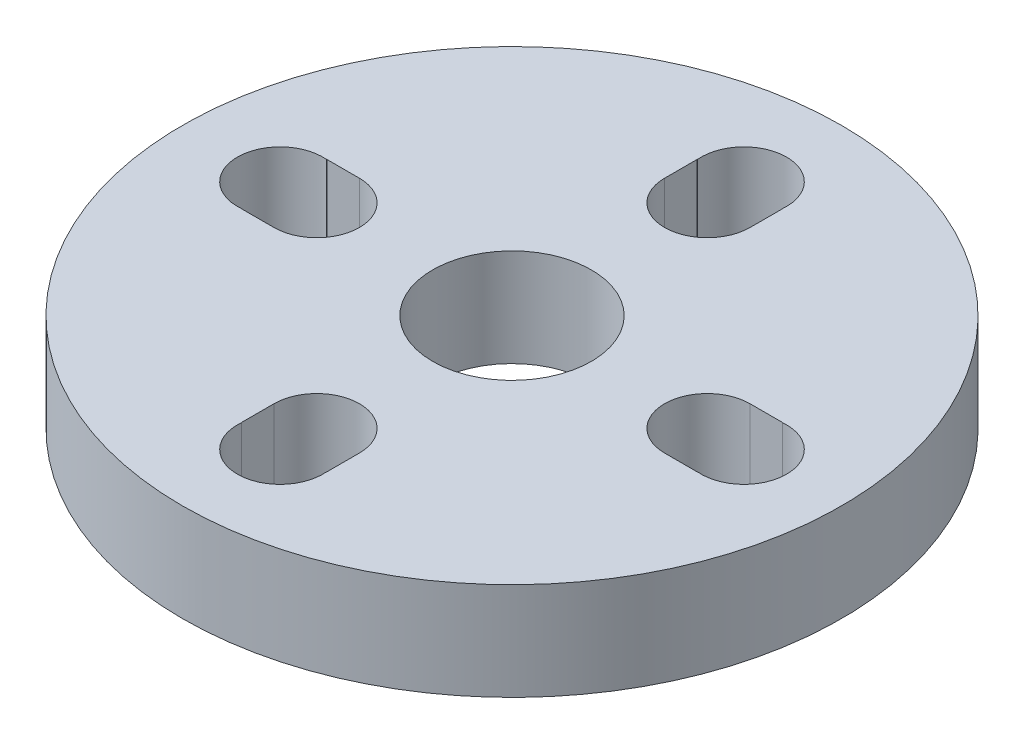
ISO-10303-21;
HEADER;
FILE_DESCRIPTION(('STEP AP214'),'2;1');
FILE_NAME('part.step','',(''),(''),'','','');
FILE_SCHEMA(('AUTOMOTIVE_DESIGN { 1 0 10303 214 1 1 1 1 }'));
ENDSEC;
DATA;
#1=APPLICATION_CONTEXT('core data for automotive mechanical design processes');
#2=APPLICATION_PROTOCOL_DEFINITION('international standard','automotive_design',2000,#1);
#3=PRODUCT_CONTEXT('',#1,'mechanical');
#4=PRODUCT('Part','Part','',(#3));
#5=PRODUCT_RELATED_PRODUCT_CATEGORY('part','',(#4));
#6=PRODUCT_DEFINITION_FORMATION('','',#4);
#7=PRODUCT_DEFINITION_CONTEXT('part definition',#1,'design');
#8=PRODUCT_DEFINITION('design','',#6,#7);
#9=PRODUCT_DEFINITION_SHAPE('','',#8);
#10=(LENGTH_UNIT() NAMED_UNIT(*) SI_UNIT(.MILLI.,.METRE.));
#11=(NAMED_UNIT(*) PLANE_ANGLE_UNIT() SI_UNIT($,.RADIAN.));
#12=(NAMED_UNIT(*) SI_UNIT($,.STERADIAN.) SOLID_ANGLE_UNIT());
#13=UNCERTAINTY_MEASURE_WITH_UNIT(LENGTH_MEASURE(1.E-05),#10,'distance_accuracy_value','');
#14=(GEOMETRIC_REPRESENTATION_CONTEXT(3) GLOBAL_UNCERTAINTY_ASSIGNED_CONTEXT((#13)) GLOBAL_UNIT_ASSIGNED_CONTEXT((#10,
#11,#12)) REPRESENTATION_CONTEXT('',''));
#15=CARTESIAN_POINT('',(0.,0.,0.));
#16=DIRECTION('',(0.,0.,1.));
#17=DIRECTION('',(1.,0.,0.));
#18=AXIS2_PLACEMENT_3D('',#15,#16,#17);
#19=CARTESIAN_POINT('',(0.,4.,0.));
#20=DIRECTION('',(0.,1.,0.));
#21=DIRECTION('',(0.,0.,1.));
#22=AXIS2_PLACEMENT_3D('',#19,#20,#21);
#23=PLANE('',#22);
#24=DIRECTION('',(0.,0.,-1.));
#25=VECTOR('',#24,1.);
#26=CARTESIAN_POINT('',(1.75000000000001,4.,0.));
#27=LINE('',#26,#25);
#28=CARTESIAN_POINT('',(1.75000000000004,4.,9.33742469849154));
#29=VERTEX_POINT('',#28);
#30=CARTESIAN_POINT('',(1.75000000000003,4.,7.99999999999999));
#31=VERTEX_POINT('',#30);
#32=EDGE_CURVE('E492',#29,#31,#27,.T.);
#33=ORIENTED_EDGE('',*,*,#32,.F.);
#34=CARTESIAN_POINT('',(0.,4.,0.));
#35=DIRECTION('',(0.,1.,0.));
#36=DIRECTION('',(0.,0.,1.));
#37=AXIS2_PLACEMENT_3D('',#34,#35,#36);
#38=CIRCLE('',#37,9.5);
#39=CARTESIAN_POINT('',(1.74256123286303,4.,9.33881578947368));
#40=VERTEX_POINT('',#39);
#41=EDGE_CURVE('E500',#40,#29,#38,.T.);
#42=ORIENTED_EDGE('',*,*,#41,.F.);
#43=CARTESIAN_POINT('',(0.,4.,9.5));
#44=DIRECTION('',(0.,-1.,0.));
#45=DIRECTION('',(0.,0.,-1.));
#46=AXIS2_PLACEMENT_3D('',#43,#44,#45);
#47=CIRCLE('',#46,1.75);
#48=CARTESIAN_POINT('',(-1.74256123286296,4.,9.33881578947369));
#49=VERTEX_POINT('',#48);
#50=EDGE_CURVE('E483',#40,#49,#47,.T.);
#51=ORIENTED_EDGE('',*,*,#50,.T.);
#52=CARTESIAN_POINT('',(0.,4.,0.));
#53=DIRECTION('',(0.,1.,0.));
#54=DIRECTION('',(0.,0.,1.));
#55=AXIS2_PLACEMENT_3D('',#52,#53,#54);
#56=CIRCLE('',#55,9.5);
#57=CARTESIAN_POINT('',(-1.74999999999996,4.,9.33742469849156));
#58=VERTEX_POINT('',#57);
#59=EDGE_CURVE('E320',#58,#49,#56,.T.);
#60=ORIENTED_EDGE('',*,*,#59,.F.);
#61=DIRECTION('',(0.,0.,-1.));
#62=VECTOR('',#61,1.);
#63=CARTESIAN_POINT('',(-1.75,4.,0.));
#64=LINE('',#63,#62);
#65=CARTESIAN_POINT('',(-1.74999999999997,4.,8.00000000000001));
#66=VERTEX_POINT('',#65);
#67=EDGE_CURVE('E465',#58,#66,#64,.T.);
#68=ORIENTED_EDGE('',*,*,#67,.T.);
#69=CARTESIAN_POINT('',(0.,4.,8.));
#70=DIRECTION('',(0.,-1.,0.));
#71=DIRECTION('',(0.,0.,-1.));
#72=AXIS2_PLACEMENT_3D('',#69,#70,#71);
#73=CIRCLE('',#72,1.75);
#74=EDGE_CURVE('E797',#66,#31,#73,.T.);
#75=ORIENTED_EDGE('',*,*,#74,.T.);
#76=EDGE_LOOP('',(#33,#42,#51,#60,#68,#75));
#77=FACE_BOUND('',#76,.T.);
#78=CARTESIAN_POINT('',(0.,4.,0.));
#79=DIRECTION('',(0.,1.,0.));
#80=DIRECTION('',(0.,0.,1.));
#81=AXIS2_PLACEMENT_3D('',#78,#79,#80);
#82=CIRCLE('',#81,3.25);
#83=CARTESIAN_POINT('',(0.,4.,3.25));
#84=VERTEX_POINT('',#83);
#85=EDGE_CURVE('E590',#84,#84,#82,.T.);
#86=ORIENTED_EDGE('',*,*,#85,.F.);
#87=EDGE_LOOP('',(#86));
#88=FACE_BOUND('',#87,.T.);
#89=CARTESIAN_POINT('',(0.,4.,0.));
#90=DIRECTION('',(0.,1.,0.));
#91=DIRECTION('',(0.,0.,1.));
#92=AXIS2_PLACEMENT_3D('',#89,#90,#91);
#93=CIRCLE('',#92,9.5);
#94=CARTESIAN_POINT('',(1.75000000000004,4.,-9.33742469849154));
#95=VERTEX_POINT('',#94);
#96=CARTESIAN_POINT('',(1.74256123286303,4.,-9.33881578947368));
#97=VERTEX_POINT('',#96);
#98=EDGE_CURVE('E585',#95,#97,#93,.T.);
#99=ORIENTED_EDGE('',*,*,#98,.F.);
#100=DIRECTION('',(0.,0.,1.));
#101=VECTOR('',#100,1.);
#102=CARTESIAN_POINT('',(1.75000000000001,4.,0.));
#103=LINE('',#102,#101);
#104=CARTESIAN_POINT('',(1.75000000000003,4.,-7.99999999999999));
#105=VERTEX_POINT('',#104);
#106=EDGE_CURVE('E593',#95,#105,#103,.T.);
#107=ORIENTED_EDGE('',*,*,#106,.T.);
#108=CARTESIAN_POINT('',(0.,4.,-8.));
#109=DIRECTION('',(0.,1.,0.));
#110=DIRECTION('',(0.,0.,1.));
#111=AXIS2_PLACEMENT_3D('',#108,#109,#110);
#112=CIRCLE('',#111,1.75);
#113=CARTESIAN_POINT('',(-1.74999999999996,4.,-8.00000000000001));
#114=VERTEX_POINT('',#113);
#115=EDGE_CURVE('E556',#114,#105,#112,.T.);
#116=ORIENTED_EDGE('',*,*,#115,.F.);
#117=DIRECTION('',(0.,0.,1.));
#118=VECTOR('',#117,1.);
#119=CARTESIAN_POINT('',(-1.75,4.,0.));
#120=LINE('',#119,#118);
#121=CARTESIAN_POINT('',(-1.74999999999996,4.,-9.33742469849156));
#122=VERTEX_POINT('',#121);
#123=EDGE_CURVE('E572',#122,#114,#120,.T.);
#124=ORIENTED_EDGE('',*,*,#123,.F.);
#125=CARTESIAN_POINT('',(0.,4.,0.));
#126=DIRECTION('',(0.,1.,0.));
#127=DIRECTION('',(0.,0.,1.));
#128=AXIS2_PLACEMENT_3D('',#125,#126,#127);
#129=CIRCLE('',#128,9.5);
#130=CARTESIAN_POINT('',(-1.74256123286295,4.,-9.33881578947369));
#131=VERTEX_POINT('',#130);
#132=EDGE_CURVE('E578',#131,#122,#129,.T.);
#133=ORIENTED_EDGE('',*,*,#132,.F.);
#134=CARTESIAN_POINT('',(0.,4.,-9.5));
#135=DIRECTION('',(0.,1.,0.));
#136=DIRECTION('',(0.,0.,1.));
#137=AXIS2_PLACEMENT_3D('',#134,#135,#136);
#138=CIRCLE('',#137,1.75);
#139=EDGE_CURVE('E555',#97,#131,#138,.T.);
#140=ORIENTED_EDGE('',*,*,#139,.F.);
#141=EDGE_LOOP('',(#99,#107,#116,#124,#133,#140));
#142=FACE_BOUND('',#141,.T.);
#143=DIRECTION('',(1.,0.,0.));
#144=VECTOR('',#143,1.);
#145=CARTESIAN_POINT('',(0.,4.,1.75));
#146=LINE('',#145,#144);
#147=CARTESIAN_POINT('',(-9.33742469849155,4.,1.75));
#148=VERTEX_POINT('',#147);
#149=CARTESIAN_POINT('',(-8.,4.,1.75));
#150=VERTEX_POINT('',#149);
#151=EDGE_CURVE('E613',#148,#150,#146,.T.);
#152=ORIENTED_EDGE('',*,*,#151,.F.);
#153=CARTESIAN_POINT('',(0.,4.,0.));
#154=DIRECTION('',(0.,1.,0.));
#155=DIRECTION('',(0.,0.,1.));
#156=AXIS2_PLACEMENT_3D('',#153,#154,#155);
#157=CIRCLE('',#156,9.5);
#158=CARTESIAN_POINT('',(-9.33881578947368,4.,1.74256123286299));
#159=VERTEX_POINT('',#158);
#160=EDGE_CURVE('E610',#159,#148,#157,.T.);
#161=ORIENTED_EDGE('',*,*,#160,.F.);
#162=CARTESIAN_POINT('',(-9.5,4.,0.));
#163=DIRECTION('',(0.,1.,0.));
#164=DIRECTION('',(0.,0.,1.));
#165=AXIS2_PLACEMENT_3D('',#162,#163,#164);
#166=CIRCLE('',#165,1.75);
#167=CARTESIAN_POINT('',(-9.33881578947368,4.,-1.742561232863));
#168=VERTEX_POINT('',#167);
#169=EDGE_CURVE('E640',#168,#159,#166,.T.);
#170=ORIENTED_EDGE('',*,*,#169,.F.);
#171=CARTESIAN_POINT('',(0.,4.,0.));
#172=DIRECTION('',(0.,1.,0.));
#173=DIRECTION('',(0.,0.,1.));
#174=AXIS2_PLACEMENT_3D('',#171,#172,#173);
#175=CIRCLE('',#174,9.5);
#176=CARTESIAN_POINT('',(-9.33742469849155,4.,-1.75));
#177=VERTEX_POINT('',#176);
#178=EDGE_CURVE('E628',#177,#168,#175,.T.);
#179=ORIENTED_EDGE('',*,*,#178,.F.);
#180=DIRECTION('',(1.,0.,0.));
#181=VECTOR('',#180,1.);
#182=CARTESIAN_POINT('',(0.,4.,-1.75));
#183=LINE('',#182,#181);
#184=CARTESIAN_POINT('',(-8.,4.,-1.75));
#185=VERTEX_POINT('',#184);
#186=EDGE_CURVE('E624',#177,#185,#183,.T.);
#187=ORIENTED_EDGE('',*,*,#186,.T.);
#188=CARTESIAN_POINT('',(-8.,4.,0.));
#189=DIRECTION('',(0.,1.,0.));
#190=DIRECTION('',(0.,0.,1.));
#191=AXIS2_PLACEMENT_3D('',#188,#189,#190);
#192=CIRCLE('',#191,1.75);
#193=EDGE_CURVE('E558',#150,#185,#192,.T.);
#194=ORIENTED_EDGE('',*,*,#193,.F.);
#195=EDGE_LOOP('',(#152,#161,#170,#179,#187,#194));
#196=FACE_BOUND('',#195,.T.);
#197=CARTESIAN_POINT('',(0.,4.,0.));
#198=DIRECTION('',(0.,1.,0.));
#199=DIRECTION('',(0.,0.,1.));
#200=AXIS2_PLACEMENT_3D('',#197,#198,#199);
#201=CIRCLE('',#200,13.5);
#202=CARTESIAN_POINT('',(0.,4.,13.5));
#203=VERTEX_POINT('',#202);
#204=EDGE_CURVE('E12',#203,#203,#201,.T.);
#205=ORIENTED_EDGE('',*,*,#204,.T.);
#206=EDGE_LOOP('',(#205));
#207=FACE_BOUND('',#206,.T.);
#208=CARTESIAN_POINT('',(0.,4.,0.));
#209=DIRECTION('',(0.,1.,0.));
#210=DIRECTION('',(0.,0.,1.));
#211=AXIS2_PLACEMENT_3D('',#208,#209,#210);
#212=CIRCLE('',#211,9.5);
#213=CARTESIAN_POINT('',(9.33881578947368,4.,-1.74256123286299));
#214=VERTEX_POINT('',#213);
#215=CARTESIAN_POINT('',(9.33742469849155,4.,-1.75));
#216=VERTEX_POINT('',#215);
#217=EDGE_CURVE('E527',#214,#216,#212,.T.);
#218=ORIENTED_EDGE('',*,*,#217,.F.);
#219=CARTESIAN_POINT('',(9.5,4.,0.));
#220=DIRECTION('',(0.,-1.,0.));
#221=DIRECTION('',(0.,0.,-1.));
#222=AXIS2_PLACEMENT_3D('',#219,#220,#221);
#223=CIRCLE('',#222,1.75);
#224=CARTESIAN_POINT('',(9.33881578947368,4.,1.74256123286299));
#225=VERTEX_POINT('',#224);
#226=EDGE_CURVE('E509',#214,#225,#223,.T.);
#227=ORIENTED_EDGE('',*,*,#226,.T.);
#228=CARTESIAN_POINT('',(0.,4.,0.));
#229=DIRECTION('',(0.,1.,0.));
#230=DIRECTION('',(0.,0.,1.));
#231=AXIS2_PLACEMENT_3D('',#228,#229,#230);
#232=CIRCLE('',#231,9.5);
#233=CARTESIAN_POINT('',(9.33742469849155,4.,1.75));
#234=VERTEX_POINT('',#233);
#235=EDGE_CURVE('E544',#234,#225,#232,.T.);
#236=ORIENTED_EDGE('',*,*,#235,.F.);
#237=DIRECTION('',(-1.,0.,0.));
#238=VECTOR('',#237,1.);
#239=CARTESIAN_POINT('',(0.,4.,1.75));
#240=LINE('',#239,#238);
#241=CARTESIAN_POINT('',(8.,4.,1.75));
#242=VERTEX_POINT('',#241);
#243=EDGE_CURVE('E537',#234,#242,#240,.T.);
#244=ORIENTED_EDGE('',*,*,#243,.T.);
#245=CARTESIAN_POINT('',(8.,4.,0.));
#246=DIRECTION('',(0.,-1.,0.));
#247=DIRECTION('',(0.,0.,-1.));
#248=AXIS2_PLACEMENT_3D('',#245,#246,#247);
#249=CIRCLE('',#248,1.75);
#250=CARTESIAN_POINT('',(8.,4.,-1.75));
#251=VERTEX_POINT('',#250);
#252=EDGE_CURVE('E515',#242,#251,#249,.T.);
#253=ORIENTED_EDGE('',*,*,#252,.T.);
#254=DIRECTION('',(-1.,0.,0.));
#255=VECTOR('',#254,1.);
#256=CARTESIAN_POINT('',(0.,4.,-1.75));
#257=LINE('',#256,#255);
#258=EDGE_CURVE('E312',#216,#251,#257,.T.);
#259=ORIENTED_EDGE('',*,*,#258,.F.);
#260=EDGE_LOOP('',(#218,#227,#236,#244,#253,#259));
#261=FACE_BOUND('',#260,.T.);
#262=ADVANCED_FACE('F297',(#77,#88,#142,#196,#207,#261),#23,.T.);
#263=CARTESIAN_POINT('',(0.,0.,0.));
#264=DIRECTION('',(0.,1.,0.));
#265=DIRECTION('',(0.,0.,1.));
#266=AXIS2_PLACEMENT_3D('',#263,#264,#265);
#267=PLANE('',#266);
#268=CARTESIAN_POINT('',(0.,0.,0.));
#269=DIRECTION('',(0.,1.,0.));
#270=DIRECTION('',(0.,0.,1.));
#271=AXIS2_PLACEMENT_3D('',#268,#269,#270);
#272=CIRCLE('',#271,13.5);
#273=CARTESIAN_POINT('',(0.,0.,13.5));
#274=VERTEX_POINT('',#273);
#275=EDGE_CURVE('E301',#274,#274,#272,.T.);
#276=ORIENTED_EDGE('',*,*,#275,.F.);
#277=EDGE_LOOP('',(#276));
#278=FACE_BOUND('',#277,.T.);
#279=CARTESIAN_POINT('',(0.,0.,0.));
#280=DIRECTION('',(0.,1.,0.));
#281=DIRECTION('',(0.,0.,1.));
#282=AXIS2_PLACEMENT_3D('',#279,#280,#281);
#283=CIRCLE('',#282,9.5);
#284=CARTESIAN_POINT('',(-9.33742469849155,0.,1.75));
#285=VERTEX_POINT('',#284);
#286=CARTESIAN_POINT('',(-9.33881578947368,0.,1.742561232863));
#287=VERTEX_POINT('',#286);
#288=EDGE_CURVE('E605',#285,#287,#283,.F.);
#289=ORIENTED_EDGE('',*,*,#288,.F.);
#290=DIRECTION('',(-1.,0.,0.));
#291=VECTOR('',#290,1.);
#292=CARTESIAN_POINT('',(0.,0.,1.75));
#293=LINE('',#292,#291);
#294=CARTESIAN_POINT('',(-8.,0.,1.75));
#295=VERTEX_POINT('',#294);
#296=EDGE_CURVE('E607',#295,#285,#293,.T.);
#297=ORIENTED_EDGE('',*,*,#296,.F.);
#298=CARTESIAN_POINT('',(-8.,0.,0.));
#299=DIRECTION('',(0.,1.,0.));
#300=DIRECTION('',(0.,0.,1.));
#301=AXIS2_PLACEMENT_3D('',#298,#299,#300);
#302=CIRCLE('',#301,1.75);
#303=CARTESIAN_POINT('',(-8.,0.,-1.75));
#304=VERTEX_POINT('',#303);
#305=EDGE_CURVE('E643',#304,#295,#302,.F.);
#306=ORIENTED_EDGE('',*,*,#305,.F.);
#307=DIRECTION('',(-1.,0.,0.));
#308=VECTOR('',#307,1.);
#309=CARTESIAN_POINT('',(0.,0.,-1.75));
#310=LINE('',#309,#308);
#311=CARTESIAN_POINT('',(-9.33742469849155,0.,-1.75));
#312=VERTEX_POINT('',#311);
#313=EDGE_CURVE('E608',#304,#312,#310,.T.);
#314=ORIENTED_EDGE('',*,*,#313,.T.);
#315=CARTESIAN_POINT('',(0.,0.,0.));
#316=DIRECTION('',(0.,1.,0.));
#317=DIRECTION('',(0.,0.,1.));
#318=AXIS2_PLACEMENT_3D('',#315,#316,#317);
#319=CIRCLE('',#318,9.5);
#320=CARTESIAN_POINT('',(-9.33881578947368,0.,-1.74256123286299));
#321=VERTEX_POINT('',#320);
#322=EDGE_CURVE('E622',#321,#312,#319,.F.);
#323=ORIENTED_EDGE('',*,*,#322,.F.);
#324=CARTESIAN_POINT('',(-9.5,0.,0.));
#325=DIRECTION('',(0.,1.,0.));
#326=DIRECTION('',(0.,0.,1.));
#327=AXIS2_PLACEMENT_3D('',#324,#325,#326);
#328=CIRCLE('',#327,1.75);
#329=EDGE_CURVE('E625',#287,#321,#328,.F.);
#330=ORIENTED_EDGE('',*,*,#329,.F.);
#331=EDGE_LOOP('',(#289,#297,#306,#314,#323,#330));
#332=FACE_BOUND('',#331,.T.);
#333=DIRECTION('',(0.,0.,-1.));
#334=VECTOR('',#333,1.);
#335=CARTESIAN_POINT('',(1.75000000000001,0.,0.));
#336=LINE('',#335,#334);
#337=CARTESIAN_POINT('',(1.75000000000003,0.,-7.99999999999999));
#338=VERTEX_POINT('',#337);
#339=CARTESIAN_POINT('',(1.75000000000004,0.,-9.33742469849154));
#340=VERTEX_POINT('',#339);
#341=EDGE_CURVE('E568',#338,#340,#336,.T.);
#342=ORIENTED_EDGE('',*,*,#341,.T.);
#343=CARTESIAN_POINT('',(0.,0.,0.));
#344=DIRECTION('',(0.,1.,0.));
#345=DIRECTION('',(0.,0.,1.));
#346=AXIS2_PLACEMENT_3D('',#343,#344,#345);
#347=CIRCLE('',#346,9.5);
#348=CARTESIAN_POINT('',(1.74256123286303,0.,-9.33881578947368));
#349=VERTEX_POINT('',#348);
#350=EDGE_CURVE('E596',#349,#340,#347,.F.);
#351=ORIENTED_EDGE('',*,*,#350,.F.);
#352=CARTESIAN_POINT('',(0.,0.,-9.5));
#353=DIRECTION('',(0.,1.,0.));
#354=DIRECTION('',(0.,0.,1.));
#355=AXIS2_PLACEMENT_3D('',#352,#353,#354);
#356=CIRCLE('',#355,1.75);
#357=CARTESIAN_POINT('',(-1.74256123286295,0.,-9.33881578947369));
#358=VERTEX_POINT('',#357);
#359=EDGE_CURVE('E552',#358,#349,#356,.F.);
#360=ORIENTED_EDGE('',*,*,#359,.F.);
#361=CARTESIAN_POINT('',(0.,0.,0.));
#362=DIRECTION('',(0.,1.,0.));
#363=DIRECTION('',(0.,0.,1.));
#364=AXIS2_PLACEMENT_3D('',#361,#362,#363);
#365=CIRCLE('',#364,9.5);
#366=CARTESIAN_POINT('',(-1.74999999999996,0.,-9.33742469849156));
#367=VERTEX_POINT('',#366);
#368=EDGE_CURVE('E564',#367,#358,#365,.F.);
#369=ORIENTED_EDGE('',*,*,#368,.F.);
#370=DIRECTION('',(0.,0.,-1.));
#371=VECTOR('',#370,1.);
#372=CARTESIAN_POINT('',(-1.75,0.,0.));
#373=LINE('',#372,#371);
#374=CARTESIAN_POINT('',(-1.74999999999997,0.,-8.00000000000001));
#375=VERTEX_POINT('',#374);
#376=EDGE_CURVE('E561',#375,#367,#373,.T.);
#377=ORIENTED_EDGE('',*,*,#376,.F.);
#378=CARTESIAN_POINT('',(0.,0.,-8.));
#379=DIRECTION('',(0.,1.,0.));
#380=DIRECTION('',(0.,0.,1.));
#381=AXIS2_PLACEMENT_3D('',#378,#379,#380);
#382=CIRCLE('',#381,1.75);
#383=EDGE_CURVE('E559',#338,#375,#382,.F.);
#384=ORIENTED_EDGE('',*,*,#383,.F.);
#385=EDGE_LOOP('',(#342,#351,#360,#369,#377,#384));
#386=FACE_BOUND('',#385,.T.);
#387=CARTESIAN_POINT('',(0.,0.,0.));
#388=DIRECTION('',(0.,1.,0.));
#389=DIRECTION('',(0.,0.,1.));
#390=AXIS2_PLACEMENT_3D('',#387,#388,#389);
#391=CIRCLE('',#390,3.25);
#392=CARTESIAN_POINT('',(0.,0.,3.25));
#393=VERTEX_POINT('',#392);
#394=EDGE_CURVE('E600',#393,#393,#391,.F.);
#395=ORIENTED_EDGE('',*,*,#394,.F.);
#396=EDGE_LOOP('',(#395));
#397=FACE_BOUND('',#396,.T.);
#398=CARTESIAN_POINT('',(0.,0.,0.));
#399=DIRECTION('',(0.,1.,0.));
#400=DIRECTION('',(0.,0.,1.));
#401=AXIS2_PLACEMENT_3D('',#398,#399,#400);
#402=CIRCLE('',#401,9.5);
#403=CARTESIAN_POINT('',(1.75000000000004,0.,9.33742469849154));
#404=VERTEX_POINT('',#403);
#405=CARTESIAN_POINT('',(1.74256123286304,0.,9.33881578947368));
#406=VERTEX_POINT('',#405);
#407=EDGE_CURVE('E467',#404,#406,#402,.F.);
#408=ORIENTED_EDGE('',*,*,#407,.F.);
#409=DIRECTION('',(0.,0.,1.));
#410=VECTOR('',#409,1.);
#411=CARTESIAN_POINT('',(1.75000000000001,0.,0.));
#412=LINE('',#411,#410);
#413=CARTESIAN_POINT('',(1.75000000000003,0.,7.99999999999999));
#414=VERTEX_POINT('',#413);
#415=EDGE_CURVE('E503',#414,#404,#412,.T.);
#416=ORIENTED_EDGE('',*,*,#415,.F.);
#417=CARTESIAN_POINT('',(0.,0.,8.));
#418=DIRECTION('',(0.,1.,0.));
#419=DIRECTION('',(0.,0.,1.));
#420=AXIS2_PLACEMENT_3D('',#417,#418,#419);
#421=CIRCLE('',#420,1.75);
#422=CARTESIAN_POINT('',(-1.74999999999997,0.,8.00000000000001));
#423=VERTEX_POINT('',#422);
#424=EDGE_CURVE('E482',#414,#423,#421,.T.);
#425=ORIENTED_EDGE('',*,*,#424,.T.);
#426=DIRECTION('',(0.,0.,1.));
#427=VECTOR('',#426,1.);
#428=CARTESIAN_POINT('',(-1.75,0.,0.));
#429=LINE('',#428,#427);
#430=CARTESIAN_POINT('',(-1.74999999999996,0.,9.33742469849156));
#431=VERTEX_POINT('',#430);
#432=EDGE_CURVE('E462',#423,#431,#429,.T.);
#433=ORIENTED_EDGE('',*,*,#432,.T.);
#434=CARTESIAN_POINT('',(0.,0.,0.));
#435=DIRECTION('',(0.,1.,0.));
#436=DIRECTION('',(0.,0.,1.));
#437=AXIS2_PLACEMENT_3D('',#434,#435,#436);
#438=CIRCLE('',#437,9.5);
#439=CARTESIAN_POINT('',(-1.74256123286296,0.,9.33881578947369));
#440=VERTEX_POINT('',#439);
#441=EDGE_CURVE('E470',#440,#431,#438,.F.);
#442=ORIENTED_EDGE('',*,*,#441,.F.);
#443=CARTESIAN_POINT('',(0.,0.,9.5));
#444=DIRECTION('',(0.,1.,0.));
#445=DIRECTION('',(0.,0.,1.));
#446=AXIS2_PLACEMENT_3D('',#443,#444,#445);
#447=CIRCLE('',#446,1.75);
#448=EDGE_CURVE('E486',#440,#406,#447,.T.);
#449=ORIENTED_EDGE('',*,*,#448,.T.);
#450=EDGE_LOOP('',(#408,#416,#425,#433,#442,#449));
#451=FACE_BOUND('',#450,.T.);
#452=CARTESIAN_POINT('',(9.5,0.,0.));
#453=DIRECTION('',(0.,1.,0.));
#454=DIRECTION('',(0.,0.,1.));
#455=AXIS2_PLACEMENT_3D('',#452,#453,#454);
#456=CIRCLE('',#455,1.75);
#457=CARTESIAN_POINT('',(9.33881578947368,0.,1.742561232863));
#458=VERTEX_POINT('',#457);
#459=CARTESIAN_POINT('',(9.33881578947368,0.,-1.74256123286299));
#460=VERTEX_POINT('',#459);
#461=EDGE_CURVE('E497',#458,#460,#456,.T.);
#462=ORIENTED_EDGE('',*,*,#461,.T.);
#463=CARTESIAN_POINT('',(0.,0.,0.));
#464=DIRECTION('',(0.,1.,0.));
#465=DIRECTION('',(0.,0.,1.));
#466=AXIS2_PLACEMENT_3D('',#463,#464,#465);
#467=CIRCLE('',#466,9.5);
#468=CARTESIAN_POINT('',(9.33742469849155,0.,-1.75));
#469=VERTEX_POINT('',#468);
#470=EDGE_CURVE('E518',#469,#460,#467,.F.);
#471=ORIENTED_EDGE('',*,*,#470,.F.);
#472=DIRECTION('',(1.,0.,0.));
#473=VECTOR('',#472,1.);
#474=CARTESIAN_POINT('',(0.,0.,-1.75));
#475=LINE('',#474,#473);
#476=CARTESIAN_POINT('',(8.,0.,-1.75));
#477=VERTEX_POINT('',#476);
#478=EDGE_CURVE('E530',#477,#469,#475,.T.);
#479=ORIENTED_EDGE('',*,*,#478,.F.);
#480=CARTESIAN_POINT('',(8.,0.,0.));
#481=DIRECTION('',(0.,1.,0.));
#482=DIRECTION('',(0.,0.,1.));
#483=AXIS2_PLACEMENT_3D('',#480,#481,#482);
#484=CIRCLE('',#483,1.75);
#485=CARTESIAN_POINT('',(8.,0.,1.75));
#486=VERTEX_POINT('',#485);
#487=EDGE_CURVE('E512',#477,#486,#484,.T.);
#488=ORIENTED_EDGE('',*,*,#487,.T.);
#489=DIRECTION('',(1.,0.,0.));
#490=VECTOR('',#489,1.);
#491=CARTESIAN_POINT('',(0.,0.,1.75));
#492=LINE('',#491,#490);
#493=CARTESIAN_POINT('',(9.33742469849155,0.,1.75));
#494=VERTEX_POINT('',#493);
#495=EDGE_CURVE('E525',#486,#494,#492,.T.);
#496=ORIENTED_EDGE('',*,*,#495,.T.);
#497=CARTESIAN_POINT('',(0.,0.,0.));
#498=DIRECTION('',(0.,1.,0.));
#499=DIRECTION('',(0.,0.,1.));
#500=AXIS2_PLACEMENT_3D('',#497,#498,#499);
#501=CIRCLE('',#500,9.5);
#502=EDGE_CURVE('E547',#458,#494,#501,.F.);
#503=ORIENTED_EDGE('',*,*,#502,.F.);
#504=EDGE_LOOP('',(#462,#471,#479,#488,#496,#503));
#505=FACE_BOUND('',#504,.T.);
#506=ADVANCED_FACE('F478',(#278,#332,#386,#397,#451,#505),#267,.F.);
#507=CARTESIAN_POINT('',(0.,4.,0.));
#508=DIRECTION('',(0.,-1.,0.));
#509=DIRECTION('',(0.,0.,-1.));
#510=AXIS2_PLACEMENT_3D('',#507,#508,#509);
#511=CYLINDRICAL_SURFACE('',#510,13.5);
#512=ORIENTED_EDGE('',*,*,#204,.F.);
#513=EDGE_LOOP('',(#512));
#514=FACE_BOUND('',#513,.T.);
#515=ORIENTED_EDGE('',*,*,#275,.T.);
#516=EDGE_LOOP('',(#515));
#517=FACE_BOUND('',#516,.T.);
#518=ADVANCED_FACE('F299',(#514,#517),#511,.T.);
#519=CARTESIAN_POINT('',(0.,-0.00100000000000013,0.));
#520=DIRECTION('',(0.,1.,0.));
#521=DIRECTION('',(0.,0.,1.));
#522=AXIS2_PLACEMENT_3D('',#519,#520,#521);
#523=CYLINDRICAL_SURFACE('',#522,9.5);
#524=ORIENTED_EDGE('',*,*,#288,.T.);
#525=DIRECTION('',(0.,1.,0.));
#526=VECTOR('',#525,1.);
#527=CARTESIAN_POINT('',(-9.33881578947368,-0.00100000000000013,1.74256123286299));
#528=LINE('',#527,#526);
#529=EDGE_CURVE('E616',#287,#159,#528,.T.);
#530=ORIENTED_EDGE('',*,*,#529,.T.);
#531=ORIENTED_EDGE('',*,*,#160,.T.);
#532=DIRECTION('',(0.,1.,0.));
#533=VECTOR('',#532,1.);
#534=CARTESIAN_POINT('',(-9.33742469849155,-0.00100000000000013,1.75));
#535=LINE('',#534,#533);
#536=EDGE_CURVE('E619',#285,#148,#535,.T.);
#537=ORIENTED_EDGE('',*,*,#536,.F.);
#538=EDGE_LOOP('',(#524,#530,#531,#537));
#539=FACE_BOUND('',#538,.T.);
#540=ADVANCED_FACE('F660',(#539),#523,.F.);
#541=CARTESIAN_POINT('',(0.,-0.00100000000000013,1.75));
#542=DIRECTION('',(0.,0.,1.));
#543=DIRECTION('',(1.,0.,0.));
#544=AXIS2_PLACEMENT_3D('',#541,#542,#543);
#545=PLANE('',#544);
#546=ORIENTED_EDGE('',*,*,#296,.T.);
#547=ORIENTED_EDGE('',*,*,#536,.T.);
#548=ORIENTED_EDGE('',*,*,#151,.T.);
#549=DIRECTION('',(0.,1.,0.));
#550=VECTOR('',#549,1.);
#551=CARTESIAN_POINT('',(-8.,-0.00100000000000013,1.75));
#552=LINE('',#551,#550);
#553=EDGE_CURVE('E617',#295,#150,#552,.T.);
#554=ORIENTED_EDGE('',*,*,#553,.F.);
#555=EDGE_LOOP('',(#546,#547,#548,#554));
#556=FACE_BOUND('',#555,.T.);
#557=ADVANCED_FACE('F658',(#556),#545,.F.);
#558=CARTESIAN_POINT('',(0.,-0.00100000000000013,-1.75));
#559=DIRECTION('',(0.,0.,1.));
#560=DIRECTION('',(1.,0.,0.));
#561=AXIS2_PLACEMENT_3D('',#558,#559,#560);
#562=PLANE('',#561);
#563=DIRECTION('',(0.,1.,0.));
#564=VECTOR('',#563,1.);
#565=CARTESIAN_POINT('',(-8.,-0.00100000000000013,-1.75));
#566=LINE('',#565,#564);
#567=EDGE_CURVE('E630',#304,#185,#566,.T.);
#568=ORIENTED_EDGE('',*,*,#567,.T.);
#569=ORIENTED_EDGE('',*,*,#186,.F.);
#570=DIRECTION('',(0.,1.,0.));
#571=VECTOR('',#570,1.);
#572=CARTESIAN_POINT('',(-9.33742469849155,-0.00100000000000013,-1.75));
#573=LINE('',#572,#571);
#574=EDGE_CURVE('E634',#312,#177,#573,.T.);
#575=ORIENTED_EDGE('',*,*,#574,.F.);
#576=ORIENTED_EDGE('',*,*,#313,.F.);
#577=EDGE_LOOP('',(#568,#569,#575,#576));
#578=FACE_BOUND('',#577,.T.);
#579=ADVANCED_FACE('F671',(#578),#562,.T.);
#580=CARTESIAN_POINT('',(0.,-0.00100000000000013,0.));
#581=DIRECTION('',(0.,1.,0.));
#582=DIRECTION('',(0.,0.,1.));
#583=AXIS2_PLACEMENT_3D('',#580,#581,#582);
#584=CYLINDRICAL_SURFACE('',#583,9.5);
#585=ORIENTED_EDGE('',*,*,#322,.T.);
#586=ORIENTED_EDGE('',*,*,#574,.T.);
#587=ORIENTED_EDGE('',*,*,#178,.T.);
#588=DIRECTION('',(0.,1.,0.));
#589=VECTOR('',#588,1.);
#590=CARTESIAN_POINT('',(-9.33881578947368,-0.00100000000000013,-1.74256123286299));
#591=LINE('',#590,#589);
#592=EDGE_CURVE('E631',#321,#168,#591,.T.);
#593=ORIENTED_EDGE('',*,*,#592,.F.);
#594=EDGE_LOOP('',(#585,#586,#587,#593));
#595=FACE_BOUND('',#594,.T.);
#596=ADVANCED_FACE('F676',(#595),#584,.F.);
#597=CARTESIAN_POINT('',(-8.,-0.00100000000000013,0.));
#598=DIRECTION('',(0.,1.,0.));
#599=DIRECTION('',(0.,0.,1.));
#600=AXIS2_PLACEMENT_3D('',#597,#598,#599);
#601=CYLINDRICAL_SURFACE('',#600,1.75);
#602=ORIENTED_EDGE('',*,*,#553,.T.);
#603=ORIENTED_EDGE('',*,*,#193,.T.);
#604=ORIENTED_EDGE('',*,*,#567,.F.);
#605=ORIENTED_EDGE('',*,*,#305,.T.);
#606=EDGE_LOOP('',(#602,#603,#604,#605));
#607=FACE_BOUND('',#606,.T.);
#608=ADVANCED_FACE('F650',(#607),#601,.F.);
#609=CARTESIAN_POINT('',(-9.5,-0.00100000000000013,0.));
#610=DIRECTION('',(0.,1.,0.));
#611=DIRECTION('',(0.,0.,1.));
#612=AXIS2_PLACEMENT_3D('',#609,#610,#611);
#613=CYLINDRICAL_SURFACE('',#612,1.75);
#614=ORIENTED_EDGE('',*,*,#329,.T.);
#615=ORIENTED_EDGE('',*,*,#592,.T.);
#616=ORIENTED_EDGE('',*,*,#169,.T.);
#617=ORIENTED_EDGE('',*,*,#529,.F.);
#618=EDGE_LOOP('',(#614,#615,#616,#617));
#619=FACE_BOUND('',#618,.T.);
#620=ADVANCED_FACE('F678',(#619),#613,.F.);
#621=CARTESIAN_POINT('',(1.75000000000001,-0.00100000000000013,0.));
#622=DIRECTION('',(-1.,0.,0.));
#623=DIRECTION('',(0.,0.,1.));
#624=AXIS2_PLACEMENT_3D('',#621,#622,#623);
#625=PLANE('',#624);
#626=DIRECTION('',(0.,1.,0.));
#627=VECTOR('',#626,1.);
#628=CARTESIAN_POINT('',(1.75000000000003,-0.00100000000000013,-7.99999999999999));
#629=LINE('',#628,#627);
#630=EDGE_CURVE('E583',#338,#105,#629,.T.);
#631=ORIENTED_EDGE('',*,*,#630,.T.);
#632=ORIENTED_EDGE('',*,*,#106,.F.);
#633=DIRECTION('',(0.,1.,0.));
#634=VECTOR('',#633,1.);
#635=CARTESIAN_POINT('',(1.75000000000004,-0.00100000000000013,-9.33742469849154));
#636=LINE('',#635,#634);
#637=EDGE_CURVE('E586',#340,#95,#636,.T.);
#638=ORIENTED_EDGE('',*,*,#637,.F.);
#639=ORIENTED_EDGE('',*,*,#341,.F.);
#640=EDGE_LOOP('',(#631,#632,#638,#639));
#641=FACE_BOUND('',#640,.T.);
#642=ADVANCED_FACE('F680',(#641),#625,.T.);
#643=CARTESIAN_POINT('',(0.,-0.00100000000000013,0.));
#644=DIRECTION('',(0.,1.,0.));
#645=DIRECTION('',(0.,0.,1.));
#646=AXIS2_PLACEMENT_3D('',#643,#644,#645);
#647=CYLINDRICAL_SURFACE('',#646,9.5);
#648=ORIENTED_EDGE('',*,*,#350,.T.);
#649=ORIENTED_EDGE('',*,*,#637,.T.);
#650=ORIENTED_EDGE('',*,*,#98,.T.);
#651=DIRECTION('',(0.,1.,0.));
#652=VECTOR('',#651,1.);
#653=CARTESIAN_POINT('',(1.74256123286303,-0.00100000000000013,-9.33881578947368));
#654=LINE('',#653,#652);
#655=EDGE_CURVE('E588',#349,#97,#654,.T.);
#656=ORIENTED_EDGE('',*,*,#655,.F.);
#657=EDGE_LOOP('',(#648,#649,#650,#656));
#658=FACE_BOUND('',#657,.T.);
#659=ADVANCED_FACE('F686',(#658),#647,.F.);
#660=CARTESIAN_POINT('',(0.,-0.00100000000000013,0.));
#661=DIRECTION('',(0.,1.,0.));
#662=DIRECTION('',(0.,0.,1.));
#663=AXIS2_PLACEMENT_3D('',#660,#661,#662);
#664=CYLINDRICAL_SURFACE('',#663,9.5);
#665=ORIENTED_EDGE('',*,*,#368,.T.);
#666=DIRECTION('',(0.,1.,0.));
#667=VECTOR('',#666,1.);
#668=CARTESIAN_POINT('',(-1.74256123286295,-0.00100000000000013,-9.33881578947369));
#669=LINE('',#668,#667);
#670=EDGE_CURVE('E569',#358,#131,#669,.T.);
#671=ORIENTED_EDGE('',*,*,#670,.T.);
#672=ORIENTED_EDGE('',*,*,#132,.T.);
#673=DIRECTION('',(0.,1.,0.));
#674=VECTOR('',#673,1.);
#675=CARTESIAN_POINT('',(-1.74999999999996,-0.00100000000000013,-9.33742469849156));
#676=LINE('',#675,#674);
#677=EDGE_CURVE('E573',#367,#122,#676,.T.);
#678=ORIENTED_EDGE('',*,*,#677,.F.);
#679=EDGE_LOOP('',(#665,#671,#672,#678));
#680=FACE_BOUND('',#679,.T.);
#681=ADVANCED_FACE('F725',(#680),#664,.F.);
#682=CARTESIAN_POINT('',(-1.75,-0.00100000000000013,0.));
#683=DIRECTION('',(-1.,0.,0.));
#684=DIRECTION('',(0.,0.,1.));
#685=AXIS2_PLACEMENT_3D('',#682,#683,#684);
#686=PLANE('',#685);
#687=ORIENTED_EDGE('',*,*,#376,.T.);
#688=ORIENTED_EDGE('',*,*,#677,.T.);
#689=ORIENTED_EDGE('',*,*,#123,.T.);
#690=DIRECTION('',(0.,1.,0.));
#691=VECTOR('',#690,1.);
#692=CARTESIAN_POINT('',(-1.74999999999997,-0.00100000000000013,-8.00000000000001));
#693=LINE('',#692,#691);
#694=EDGE_CURVE('E567',#375,#114,#693,.T.);
#695=ORIENTED_EDGE('',*,*,#694,.F.);
#696=EDGE_LOOP('',(#687,#688,#689,#695));
#697=FACE_BOUND('',#696,.T.);
#698=ADVANCED_FACE('F721',(#697),#686,.F.);
#699=CARTESIAN_POINT('',(0.,-0.00100000000000013,-9.5));
#700=DIRECTION('',(0.,1.,0.));
#701=DIRECTION('',(0.,0.,1.));
#702=AXIS2_PLACEMENT_3D('',#699,#700,#701);
#703=CYLINDRICAL_SURFACE('',#702,1.75);
#704=ORIENTED_EDGE('',*,*,#139,.T.);
#705=ORIENTED_EDGE('',*,*,#670,.F.);
#706=ORIENTED_EDGE('',*,*,#359,.T.);
#707=ORIENTED_EDGE('',*,*,#655,.T.);
#708=EDGE_LOOP('',(#704,#705,#706,#707));
#709=FACE_BOUND('',#708,.T.);
#710=ADVANCED_FACE('F728',(#709),#703,.F.);
#711=CARTESIAN_POINT('',(0.,-0.00100000000000013,-8.));
#712=DIRECTION('',(0.,1.,0.));
#713=DIRECTION('',(0.,0.,1.));
#714=AXIS2_PLACEMENT_3D('',#711,#712,#713);
#715=CYLINDRICAL_SURFACE('',#714,1.75);
#716=ORIENTED_EDGE('',*,*,#383,.T.);
#717=ORIENTED_EDGE('',*,*,#694,.T.);
#718=ORIENTED_EDGE('',*,*,#115,.T.);
#719=ORIENTED_EDGE('',*,*,#630,.F.);
#720=EDGE_LOOP('',(#716,#717,#718,#719));
#721=FACE_BOUND('',#720,.T.);
#722=ADVANCED_FACE('F689',(#721),#715,.F.);
#723=CARTESIAN_POINT('',(0.,-0.00100000000000013,0.));
#724=DIRECTION('',(0.,1.,0.));
#725=DIRECTION('',(0.,0.,1.));
#726=AXIS2_PLACEMENT_3D('',#723,#724,#725);
#727=CYLINDRICAL_SURFACE('',#726,3.25);
#728=ORIENTED_EDGE('',*,*,#85,.T.);
#729=EDGE_LOOP('',(#728));
#730=FACE_BOUND('',#729,.T.);
#731=ORIENTED_EDGE('',*,*,#394,.T.);
#732=EDGE_LOOP('',(#731));
#733=FACE_BOUND('',#732,.T.);
#734=ADVANCED_FACE('F732',(#730,#733),#727,.F.);
#735=CARTESIAN_POINT('',(0.,-0.00100000000000013,0.));
#736=DIRECTION('',(0.,1.,0.));
#737=DIRECTION('',(0.,0.,1.));
#738=AXIS2_PLACEMENT_3D('',#735,#736,#737);
#739=CYLINDRICAL_SURFACE('',#738,9.5);
#740=ORIENTED_EDGE('',*,*,#407,.T.);
#741=DIRECTION('',(0.,1.,0.));
#742=VECTOR('',#741,1.);
#743=CARTESIAN_POINT('',(1.74256123286303,-0.00100000000000013,9.33881578947368));
#744=LINE('',#743,#742);
#745=EDGE_CURVE('E490',#406,#40,#744,.T.);
#746=ORIENTED_EDGE('',*,*,#745,.T.);
#747=ORIENTED_EDGE('',*,*,#41,.T.);
#748=DIRECTION('',(0.,1.,0.));
#749=VECTOR('',#748,1.);
#750=CARTESIAN_POINT('',(1.75000000000004,-0.00100000000000013,9.33742469849154));
#751=LINE('',#750,#749);
#752=EDGE_CURVE('E493',#404,#29,#751,.T.);
#753=ORIENTED_EDGE('',*,*,#752,.F.);
#754=EDGE_LOOP('',(#740,#746,#747,#753));
#755=FACE_BOUND('',#754,.T.);
#756=ADVANCED_FACE('F734',(#755),#739,.F.);
#757=CARTESIAN_POINT('',(1.75000000000001,-0.00100000000000013,0.));
#758=DIRECTION('',(1.,0.,0.));
#759=DIRECTION('',(0.,0.,-1.));
#760=AXIS2_PLACEMENT_3D('',#757,#758,#759);
#761=PLANE('',#760);
#762=ORIENTED_EDGE('',*,*,#415,.T.);
#763=ORIENTED_EDGE('',*,*,#752,.T.);
#764=ORIENTED_EDGE('',*,*,#32,.T.);
#765=DIRECTION('',(0.,1.,0.));
#766=VECTOR('',#765,1.);
#767=CARTESIAN_POINT('',(1.75000000000003,-0.00100000000000013,7.99999999999999));
#768=LINE('',#767,#766);
#769=EDGE_CURVE('E495',#414,#31,#768,.T.);
#770=ORIENTED_EDGE('',*,*,#769,.F.);
#771=EDGE_LOOP('',(#762,#763,#764,#770));
#772=FACE_BOUND('',#771,.T.);
#773=ADVANCED_FACE('F741',(#772),#761,.F.);
#774=CARTESIAN_POINT('',(-1.75,-0.00100000000000013,0.));
#775=DIRECTION('',(1.,0.,0.));
#776=DIRECTION('',(0.,0.,-1.));
#777=AXIS2_PLACEMENT_3D('',#774,#775,#776);
#778=PLANE('',#777);
#779=DIRECTION('',(0.,1.,0.));
#780=VECTOR('',#779,1.);
#781=CARTESIAN_POINT('',(-1.74999999999997,-0.00100000000000013,8.00000000000001));
#782=LINE('',#781,#780);
#783=EDGE_CURVE('E466',#423,#66,#782,.T.);
#784=ORIENTED_EDGE('',*,*,#783,.T.);
#785=ORIENTED_EDGE('',*,*,#67,.F.);
#786=DIRECTION('',(0.,1.,0.));
#787=VECTOR('',#786,1.);
#788=CARTESIAN_POINT('',(-1.74999999999996,-0.00100000000000013,9.33742469849156));
#789=LINE('',#788,#787);
#790=EDGE_CURVE('E458',#431,#58,#789,.T.);
#791=ORIENTED_EDGE('',*,*,#790,.F.);
#792=ORIENTED_EDGE('',*,*,#432,.F.);
#793=EDGE_LOOP('',(#784,#785,#791,#792));
#794=FACE_BOUND('',#793,.T.);
#795=ADVANCED_FACE('F460',(#794),#778,.T.);
#796=CARTESIAN_POINT('',(0.,-0.00100000000000013,0.));
#797=DIRECTION('',(0.,1.,0.));
#798=DIRECTION('',(0.,0.,1.));
#799=AXIS2_PLACEMENT_3D('',#796,#797,#798);
#800=CYLINDRICAL_SURFACE('',#799,9.5);
#801=ORIENTED_EDGE('',*,*,#441,.T.);
#802=ORIENTED_EDGE('',*,*,#790,.T.);
#803=ORIENTED_EDGE('',*,*,#59,.T.);
#804=DIRECTION('',(0.,1.,0.));
#805=VECTOR('',#804,1.);
#806=CARTESIAN_POINT('',(-1.74256123286295,-0.00100000000000013,9.33881578947369));
#807=LINE('',#806,#805);
#808=EDGE_CURVE('E472',#440,#49,#807,.T.);
#809=ORIENTED_EDGE('',*,*,#808,.F.);
#810=EDGE_LOOP('',(#801,#802,#803,#809));
#811=FACE_BOUND('',#810,.T.);
#812=ADVANCED_FACE('F471',(#811),#800,.F.);
#813=CARTESIAN_POINT('',(0.,-0.00100000000000013,8.));
#814=DIRECTION('',(0.,1.,0.));
#815=DIRECTION('',(0.,0.,1.));
#816=AXIS2_PLACEMENT_3D('',#813,#814,#815);
#817=CYLINDRICAL_SURFACE('',#816,1.75);
#818=ORIENTED_EDGE('',*,*,#74,.F.);
#819=ORIENTED_EDGE('',*,*,#783,.F.);
#820=ORIENTED_EDGE('',*,*,#424,.F.);
#821=ORIENTED_EDGE('',*,*,#769,.T.);
#822=EDGE_LOOP('',(#818,#819,#820,#821));
#823=FACE_BOUND('',#822,.T.);
#824=ADVANCED_FACE('F788',(#823),#817,.F.);
#825=CARTESIAN_POINT('',(0.,-0.00100000000000013,9.5));
#826=DIRECTION('',(0.,1.,0.));
#827=DIRECTION('',(0.,0.,1.));
#828=AXIS2_PLACEMENT_3D('',#825,#826,#827);
#829=CYLINDRICAL_SURFACE('',#828,1.75);
#830=ORIENTED_EDGE('',*,*,#448,.F.);
#831=ORIENTED_EDGE('',*,*,#808,.T.);
#832=ORIENTED_EDGE('',*,*,#50,.F.);
#833=ORIENTED_EDGE('',*,*,#745,.F.);
#834=EDGE_LOOP('',(#830,#831,#832,#833));
#835=FACE_BOUND('',#834,.T.);
#836=ADVANCED_FACE('F761',(#835),#829,.F.);
#837=CARTESIAN_POINT('',(0.,-0.00100000000000013,1.75));
#838=DIRECTION('',(0.,0.,-1.));
#839=DIRECTION('',(-1.,0.,0.));
#840=AXIS2_PLACEMENT_3D('',#837,#838,#839);
#841=PLANE('',#840);
#842=DIRECTION('',(0.,1.,0.));
#843=VECTOR('',#842,1.);
#844=CARTESIAN_POINT('',(8.,-0.00100000000000013,1.75));
#845=LINE('',#844,#843);
#846=EDGE_CURVE('E538',#486,#242,#845,.T.);
#847=ORIENTED_EDGE('',*,*,#846,.T.);
#848=ORIENTED_EDGE('',*,*,#243,.F.);
#849=DIRECTION('',(0.,1.,0.));
#850=VECTOR('',#849,1.);
#851=CARTESIAN_POINT('',(9.33742469849155,-0.00100000000000013,1.75));
#852=LINE('',#851,#850);
#853=EDGE_CURVE('E540',#494,#234,#852,.T.);
#854=ORIENTED_EDGE('',*,*,#853,.F.);
#855=ORIENTED_EDGE('',*,*,#495,.F.);
#856=EDGE_LOOP('',(#847,#848,#854,#855));
#857=FACE_BOUND('',#856,.T.);
#858=ADVANCED_FACE('F757',(#857),#841,.T.);
#859=CARTESIAN_POINT('',(0.,-0.00100000000000013,0.));
#860=DIRECTION('',(0.,1.,0.));
#861=DIRECTION('',(0.,0.,1.));
#862=AXIS2_PLACEMENT_3D('',#859,#860,#861);
#863=CYLINDRICAL_SURFACE('',#862,9.5);
#864=ORIENTED_EDGE('',*,*,#502,.T.);
#865=ORIENTED_EDGE('',*,*,#853,.T.);
#866=ORIENTED_EDGE('',*,*,#235,.T.);
#867=DIRECTION('',(0.,1.,0.));
#868=VECTOR('',#867,1.);
#869=CARTESIAN_POINT('',(9.33881578947368,-0.00100000000000013,1.74256123286299));
#870=LINE('',#869,#868);
#871=EDGE_CURVE('E535',#458,#225,#870,.T.);
#872=ORIENTED_EDGE('',*,*,#871,.F.);
#873=EDGE_LOOP('',(#864,#865,#866,#872));
#874=FACE_BOUND('',#873,.T.);
#875=ADVANCED_FACE('F760',(#874),#863,.F.);
#876=CARTESIAN_POINT('',(0.,-0.00100000000000013,-1.75));
#877=DIRECTION('',(0.,0.,-1.));
#878=DIRECTION('',(-1.,0.,0.));
#879=AXIS2_PLACEMENT_3D('',#876,#877,#878);
#880=PLANE('',#879);
#881=ORIENTED_EDGE('',*,*,#478,.T.);
#882=DIRECTION('',(0.,1.,0.));
#883=VECTOR('',#882,1.);
#884=CARTESIAN_POINT('',(9.33742469849155,-0.00100000000000013,-1.75));
#885=LINE('',#884,#883);
#886=EDGE_CURVE('E521',#469,#216,#885,.T.);
#887=ORIENTED_EDGE('',*,*,#886,.T.);
#888=ORIENTED_EDGE('',*,*,#258,.T.);
#889=DIRECTION('',(0.,1.,0.));
#890=VECTOR('',#889,1.);
#891=CARTESIAN_POINT('',(8.,-0.00100000000000013,-1.75));
#892=LINE('',#891,#890);
#893=EDGE_CURVE('E523',#477,#251,#892,.T.);
#894=ORIENTED_EDGE('',*,*,#893,.F.);
#895=EDGE_LOOP('',(#881,#887,#888,#894));
#896=FACE_BOUND('',#895,.T.);
#897=ADVANCED_FACE('F765',(#896),#880,.F.);
#898=CARTESIAN_POINT('',(0.,-0.00100000000000013,0.));
#899=DIRECTION('',(0.,1.,0.));
#900=DIRECTION('',(0.,0.,1.));
#901=AXIS2_PLACEMENT_3D('',#898,#899,#900);
#902=CYLINDRICAL_SURFACE('',#901,9.5);
#903=ORIENTED_EDGE('',*,*,#470,.T.);
#904=DIRECTION('',(0.,1.,0.));
#905=VECTOR('',#904,1.);
#906=CARTESIAN_POINT('',(9.33881578947368,-0.00100000000000013,-1.74256123286299));
#907=LINE('',#906,#905);
#908=EDGE_CURVE('E519',#460,#214,#907,.T.);
#909=ORIENTED_EDGE('',*,*,#908,.T.);
#910=ORIENTED_EDGE('',*,*,#217,.T.);
#911=ORIENTED_EDGE('',*,*,#886,.F.);
#912=EDGE_LOOP('',(#903,#909,#910,#911));
#913=FACE_BOUND('',#912,.T.);
#914=ADVANCED_FACE('F769',(#913),#902,.F.);
#915=CARTESIAN_POINT('',(9.5,-0.00100000000000013,0.));
#916=DIRECTION('',(0.,1.,0.));
#917=DIRECTION('',(0.,0.,1.));
#918=AXIS2_PLACEMENT_3D('',#915,#916,#917);
#919=CYLINDRICAL_SURFACE('',#918,1.75);
#920=ORIENTED_EDGE('',*,*,#871,.T.);
#921=ORIENTED_EDGE('',*,*,#226,.F.);
#922=ORIENTED_EDGE('',*,*,#908,.F.);
#923=ORIENTED_EDGE('',*,*,#461,.F.);
#924=EDGE_LOOP('',(#920,#921,#922,#923));
#925=FACE_BOUND('',#924,.T.);
#926=ADVANCED_FACE('F772',(#925),#919,.F.);
#927=CARTESIAN_POINT('',(8.,-0.00100000000000013,0.));
#928=DIRECTION('',(0.,1.,0.));
#929=DIRECTION('',(0.,0.,1.));
#930=AXIS2_PLACEMENT_3D('',#927,#928,#929);
#931=CYLINDRICAL_SURFACE('',#930,1.75);
#932=ORIENTED_EDGE('',*,*,#487,.F.);
#933=ORIENTED_EDGE('',*,*,#893,.T.);
#934=ORIENTED_EDGE('',*,*,#252,.F.);
#935=ORIENTED_EDGE('',*,*,#846,.F.);
#936=EDGE_LOOP('',(#932,#933,#934,#935));
#937=FACE_BOUND('',#936,.T.);
#938=ADVANCED_FACE('F774',(#937),#931,.F.);
#939=CLOSED_SHELL('',(#262,#506,#518,#540,#557,#579,#596,#608,#620,#642,#659,#681,#698,#710,
#722,#734,#756,#773,#795,#812,#824,#836,#858,#875,#897,#914,#926,#938));
#940=MANIFOLD_SOLID_BREP('B2',#939);
#941=ADVANCED_BREP_SHAPE_REPRESENTATION('',(#18,#940),#14);
#942=SHAPE_DEFINITION_REPRESENTATION(#9,#941);
ENDSEC;
END-ISO-10303-21;
